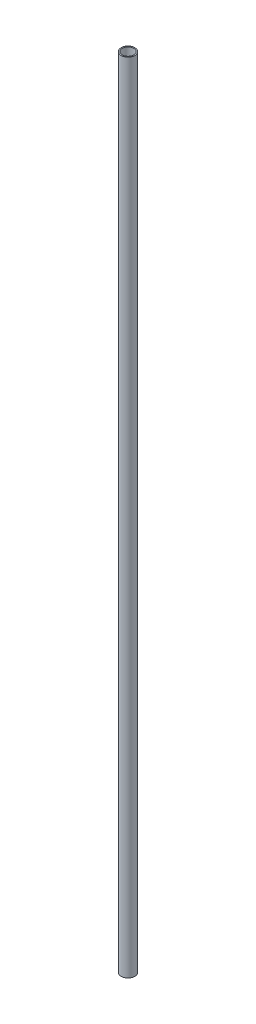
ISO-10303-21;
HEADER;
FILE_DESCRIPTION(('STEP AP214'),'2;1');
FILE_NAME('part.step','',(''),(''),'','','');
FILE_SCHEMA(('AUTOMOTIVE_DESIGN { 1 0 10303 214 1 1 1 1 }'));
ENDSEC;
DATA;
#1=APPLICATION_CONTEXT('core data for automotive mechanical design processes');
#2=APPLICATION_PROTOCOL_DEFINITION('international standard','automotive_design',2000,#1);
#3=PRODUCT_CONTEXT('',#1,'mechanical');
#4=PRODUCT('Part','Part','',(#3));
#5=PRODUCT_RELATED_PRODUCT_CATEGORY('part','',(#4));
#6=PRODUCT_DEFINITION_FORMATION('','',#4);
#7=PRODUCT_DEFINITION_CONTEXT('part definition',#1,'design');
#8=PRODUCT_DEFINITION('design','',#6,#7);
#9=PRODUCT_DEFINITION_SHAPE('','',#8);
#10=(LENGTH_UNIT() NAMED_UNIT(*) SI_UNIT(.MILLI.,.METRE.));
#11=(NAMED_UNIT(*) PLANE_ANGLE_UNIT() SI_UNIT($,.RADIAN.));
#12=(NAMED_UNIT(*) SI_UNIT($,.STERADIAN.) SOLID_ANGLE_UNIT());
#13=UNCERTAINTY_MEASURE_WITH_UNIT(LENGTH_MEASURE(1.E-05),#10,'distance_accuracy_value','');
#14=(GEOMETRIC_REPRESENTATION_CONTEXT(3) GLOBAL_UNCERTAINTY_ASSIGNED_CONTEXT((#13)) GLOBAL_UNIT_ASSIGNED_CONTEXT((#10,
#11,#12)) REPRESENTATION_CONTEXT('',''));
#15=CARTESIAN_POINT('',(0.,0.,0.));
#16=DIRECTION('',(0.,0.,1.));
#17=DIRECTION('',(1.,0.,0.));
#18=AXIS2_PLACEMENT_3D('',#15,#16,#17);
#19=CARTESIAN_POINT('',(0.,740.,0.));
#20=DIRECTION('',(0.,1.,0.));
#21=DIRECTION('',(0.,0.,1.));
#22=AXIS2_PLACEMENT_3D('',#19,#20,#21);
#23=PLANE('',#22);
#24=CARTESIAN_POINT('',(0.,740.,0.));
#25=DIRECTION('',(0.,1.,0.));
#26=DIRECTION('',(0.,0.,1.));
#27=AXIS2_PLACEMENT_3D('',#24,#25,#26);
#28=CIRCLE('',#27,6.35);
#29=CARTESIAN_POINT('',(0.,740.,6.35));
#30=VERTEX_POINT('',#29);
#31=EDGE_CURVE('E10',#30,#30,#28,.T.);
#32=ORIENTED_EDGE('',*,*,#31,.T.);
#33=EDGE_LOOP('',(#32));
#34=FACE_BOUND('',#33,.T.);
#35=CARTESIAN_POINT('',(0.,740.,0.));
#36=DIRECTION('',(0.,1.,0.));
#37=DIRECTION('',(0.,0.,1.));
#38=AXIS2_PLACEMENT_3D('',#35,#36,#37);
#39=CIRCLE('',#38,5.35);
#40=CARTESIAN_POINT('',(0.,740.,5.35));
#41=VERTEX_POINT('',#40);
#42=EDGE_CURVE('E52',#41,#41,#39,.T.);
#43=ORIENTED_EDGE('',*,*,#42,.F.);
#44=EDGE_LOOP('',(#43));
#45=FACE_BOUND('',#44,.T.);
#46=ADVANCED_FACE('F39',(#34,#45),#23,.T.);
#47=CARTESIAN_POINT('',(0.,0.,0.));
#48=DIRECTION('',(0.,1.,0.));
#49=DIRECTION('',(0.,0.,1.));
#50=AXIS2_PLACEMENT_3D('',#47,#48,#49);
#51=PLANE('',#50);
#52=CARTESIAN_POINT('',(0.,0.,0.));
#53=DIRECTION('',(0.,1.,0.));
#54=DIRECTION('',(0.,0.,1.));
#55=AXIS2_PLACEMENT_3D('',#52,#53,#54);
#56=CIRCLE('',#55,6.35);
#57=CARTESIAN_POINT('',(0.,0.,6.35));
#58=VERTEX_POINT('',#57);
#59=EDGE_CURVE('E43',#58,#58,#56,.T.);
#60=ORIENTED_EDGE('',*,*,#59,.F.);
#61=EDGE_LOOP('',(#60));
#62=FACE_BOUND('',#61,.T.);
#63=CARTESIAN_POINT('',(0.,0.,0.));
#64=DIRECTION('',(0.,1.,0.));
#65=DIRECTION('',(0.,0.,1.));
#66=AXIS2_PLACEMENT_3D('',#63,#64,#65);
#67=CIRCLE('',#66,5.35);
#68=CARTESIAN_POINT('',(0.,0.,5.35));
#69=VERTEX_POINT('',#68);
#70=EDGE_CURVE('E54',#69,#69,#67,.T.);
#71=ORIENTED_EDGE('',*,*,#70,.T.);
#72=EDGE_LOOP('',(#71));
#73=FACE_BOUND('',#72,.T.);
#74=ADVANCED_FACE('F66',(#62,#73),#51,.F.);
#75=CARTESIAN_POINT('',(0.,740.,0.));
#76=DIRECTION('',(0.,-1.,0.));
#77=DIRECTION('',(0.,0.,-1.));
#78=AXIS2_PLACEMENT_3D('',#75,#76,#77);
#79=CYLINDRICAL_SURFACE('',#78,6.35);
#80=ORIENTED_EDGE('',*,*,#31,.F.);
#81=EDGE_LOOP('',(#80));
#82=FACE_BOUND('',#81,.T.);
#83=ORIENTED_EDGE('',*,*,#59,.T.);
#84=EDGE_LOOP('',(#83));
#85=FACE_BOUND('',#84,.T.);
#86=ADVANCED_FACE('F41',(#82,#85),#79,.T.);
#87=CARTESIAN_POINT('',(0.,740.,0.));
#88=DIRECTION('',(0.,-1.,0.));
#89=DIRECTION('',(0.,0.,-1.));
#90=AXIS2_PLACEMENT_3D('',#87,#88,#89);
#91=CYLINDRICAL_SURFACE('',#90,5.35);
#92=ORIENTED_EDGE('',*,*,#42,.T.);
#93=EDGE_LOOP('',(#92));
#94=FACE_BOUND('',#93,.T.);
#95=ORIENTED_EDGE('',*,*,#70,.F.);
#96=EDGE_LOOP('',(#95));
#97=FACE_BOUND('',#96,.T.);
#98=ADVANCED_FACE('F62',(#94,#97),#91,.F.);
#99=CLOSED_SHELL('',(#46,#74,#86,#98));
#100=MANIFOLD_SOLID_BREP('B2',#99);
#101=ADVANCED_BREP_SHAPE_REPRESENTATION('',(#18,#100),#14);
#102=SHAPE_DEFINITION_REPRESENTATION(#9,#101);
ENDSEC;
END-ISO-10303-21;
